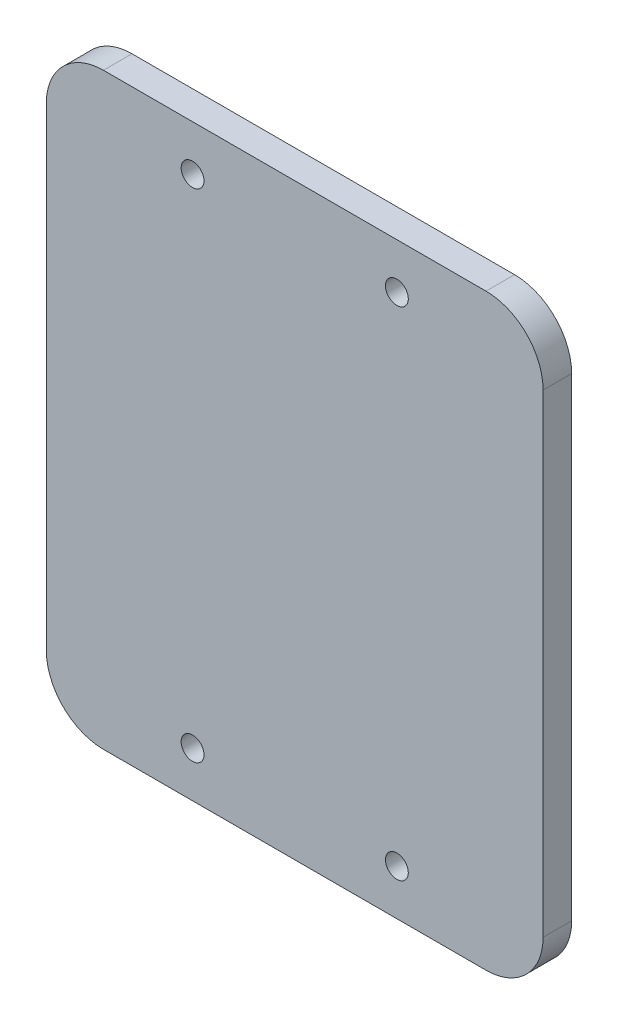
ISO-10303-21;
HEADER;
FILE_DESCRIPTION(('STEP AP214'),'2;1');
FILE_NAME('part.step','',(''),(''),'','','');
FILE_SCHEMA(('AUTOMOTIVE_DESIGN { 1 0 10303 214 1 1 1 1 }'));
ENDSEC;
DATA;
#1=APPLICATION_CONTEXT('core data for automotive mechanical design processes');
#2=APPLICATION_PROTOCOL_DEFINITION('international standard','automotive_design',2000,#1);
#3=PRODUCT_CONTEXT('',#1,'mechanical');
#4=PRODUCT('Part','Part','',(#3));
#5=PRODUCT_RELATED_PRODUCT_CATEGORY('part','',(#4));
#6=PRODUCT_DEFINITION_FORMATION('','',#4);
#7=PRODUCT_DEFINITION_CONTEXT('part definition',#1,'design');
#8=PRODUCT_DEFINITION('design','',#6,#7);
#9=PRODUCT_DEFINITION_SHAPE('','',#8);
#10=(LENGTH_UNIT() NAMED_UNIT(*) SI_UNIT(.MILLI.,.METRE.));
#11=(NAMED_UNIT(*) PLANE_ANGLE_UNIT() SI_UNIT($,.RADIAN.));
#12=(NAMED_UNIT(*) SI_UNIT($,.STERADIAN.) SOLID_ANGLE_UNIT());
#13=UNCERTAINTY_MEASURE_WITH_UNIT(LENGTH_MEASURE(1.E-05),#10,'distance_accuracy_value','');
#14=(GEOMETRIC_REPRESENTATION_CONTEXT(3) GLOBAL_UNCERTAINTY_ASSIGNED_CONTEXT((#13)) GLOBAL_UNIT_ASSIGNED_CONTEXT((#10,
#11,#12)) REPRESENTATION_CONTEXT('',''));
#15=CARTESIAN_POINT('',(0.,0.,0.));
#16=DIRECTION('',(0.,0.,1.));
#17=DIRECTION('',(1.,0.,0.));
#18=AXIS2_PLACEMENT_3D('',#15,#16,#17);
#19=CARTESIAN_POINT('',(-30.1091615376854,-82.8172384219554,5.));
#20=DIRECTION('',(0.,0.,1.));
#21=DIRECTION('',(1.,0.,0.));
#22=AXIS2_PLACEMENT_3D('',#19,#20,#21);
#23=PLANE('',#22);
#24=CARTESIAN_POINT('',(31.2808384623146,-74.8372384219554,5.));
#25=DIRECTION('',(0.,0.,1.));
#26=DIRECTION('',(1.,0.,0.));
#27=AXIS2_PLACEMENT_3D('',#24,#25,#26);
#28=CIRCLE('',#27,2.);
#29=CARTESIAN_POINT('',(33.2808384623146,-74.8372384219554,5.));
#30=VERTEX_POINT('',#29);
#31=EDGE_CURVE('E185',#30,#30,#28,.T.);
#32=ORIENTED_EDGE('',*,*,#31,.F.);
#33=EDGE_LOOP('',(#32));
#34=FACE_BOUND('',#33,.T.);
#35=CARTESIAN_POINT('',(-4.49916153768539,12.2027615780446,5.));
#36=DIRECTION('',(0.,0.,1.));
#37=DIRECTION('',(1.,0.,0.));
#38=AXIS2_PLACEMENT_3D('',#35,#36,#37);
#39=CIRCLE('',#38,2.);
#40=CARTESIAN_POINT('',(-2.49916153768539,12.2027615780446,5.));
#41=VERTEX_POINT('',#40);
#42=EDGE_CURVE('E131',#41,#41,#39,.T.);
#43=ORIENTED_EDGE('',*,*,#42,.F.);
#44=EDGE_LOOP('',(#43));
#45=FACE_BOUND('',#44,.T.);
#46=DIRECTION('',(0.,-1.,0.));
#47=VECTOR('',#46,1.);
#48=CARTESIAN_POINT('',(-30.1091615376854,20.1827615780446,5.));
#49=LINE('',#48,#47);
#50=CARTESIAN_POINT('',(-30.1091615376854,10.1827615780446,5.));
#51=VERTEX_POINT('',#50);
#52=CARTESIAN_POINT('',(-30.1091615376854,-72.8172384219554,5.));
#53=VERTEX_POINT('',#52);
#54=EDGE_CURVE('E136',#51,#53,#49,.T.);
#55=ORIENTED_EDGE('',*,*,#54,.T.);
#56=CARTESIAN_POINT('',(-20.1091615376854,-72.8172384219554,5.));
#57=DIRECTION('',(0.,0.,1.));
#58=DIRECTION('',(1.,0.,0.));
#59=AXIS2_PLACEMENT_3D('',#56,#57,#58);
#60=CIRCLE('',#59,10.);
#61=CARTESIAN_POINT('',(-20.1091615376854,-82.8172384219554,5.));
#62=VERTEX_POINT('',#61);
#63=EDGE_CURVE('E151',#53,#62,#60,.T.);
#64=ORIENTED_EDGE('',*,*,#63,.T.);
#65=DIRECTION('',(1.,0.,0.));
#66=VECTOR('',#65,1.);
#67=CARTESIAN_POINT('',(-30.1091615376854,-82.8172384219554,5.));
#68=LINE('',#67,#66);
#69=CARTESIAN_POINT('',(46.8908384623146,-82.8172384219554,5.));
#70=VERTEX_POINT('',#69);
#71=EDGE_CURVE('E118',#62,#70,#68,.T.);
#72=ORIENTED_EDGE('',*,*,#71,.T.);
#73=CARTESIAN_POINT('',(46.8908384623146,-72.8172384219554,5.));
#74=DIRECTION('',(0.,0.,1.));
#75=DIRECTION('',(1.,0.,0.));
#76=AXIS2_PLACEMENT_3D('',#73,#74,#75);
#77=CIRCLE('',#76,10.);
#78=CARTESIAN_POINT('',(56.8908384623146,-72.8172384219554,5.));
#79=VERTEX_POINT('',#78);
#80=EDGE_CURVE('E149',#70,#79,#77,.T.);
#81=ORIENTED_EDGE('',*,*,#80,.T.);
#82=DIRECTION('',(0.,1.,0.));
#83=VECTOR('',#82,1.);
#84=CARTESIAN_POINT('',(56.8908384623146,20.1827615780446,5.));
#85=LINE('',#84,#83);
#86=CARTESIAN_POINT('',(56.8908384623146,10.1827615780446,5.));
#87=VERTEX_POINT('',#86);
#88=EDGE_CURVE('E162',#79,#87,#85,.T.);
#89=ORIENTED_EDGE('',*,*,#88,.T.);
#90=CARTESIAN_POINT('',(46.8908384623146,10.1827615780446,5.));
#91=DIRECTION('',(0.,0.,1.));
#92=DIRECTION('',(1.,0.,0.));
#93=AXIS2_PLACEMENT_3D('',#90,#91,#92);
#94=CIRCLE('',#93,10.);
#95=CARTESIAN_POINT('',(46.8908384623146,20.1827615780446,5.));
#96=VERTEX_POINT('',#95);
#97=EDGE_CURVE('E53',#87,#96,#94,.T.);
#98=ORIENTED_EDGE('',*,*,#97,.T.);
#99=DIRECTION('',(-1.,0.,0.));
#100=VECTOR('',#99,1.);
#101=CARTESIAN_POINT('',(-30.1091615376854,20.1827615780446,5.));
#102=LINE('',#101,#100);
#103=CARTESIAN_POINT('',(-20.1091615376854,20.1827615780446,5.));
#104=VERTEX_POINT('',#103);
#105=EDGE_CURVE('E137',#96,#104,#102,.T.);
#106=ORIENTED_EDGE('',*,*,#105,.T.);
#107=CARTESIAN_POINT('',(-20.1091615376854,10.1827615780446,5.));
#108=DIRECTION('',(0.,0.,1.));
#109=DIRECTION('',(1.,0.,0.));
#110=AXIS2_PLACEMENT_3D('',#107,#108,#109);
#111=CIRCLE('',#110,10.);
#112=EDGE_CURVE('E146',#104,#51,#111,.T.);
#113=ORIENTED_EDGE('',*,*,#112,.T.);
#114=EDGE_LOOP('',(#55,#64,#72,#81,#89,#98,#106,#113));
#115=FACE_BOUND('',#114,.T.);
#116=CARTESIAN_POINT('',(31.2808384623146,12.2027615780446,5.));
#117=DIRECTION('',(0.,0.,1.));
#118=DIRECTION('',(-1.,0.,0.));
#119=AXIS2_PLACEMENT_3D('',#116,#117,#118);
#120=CIRCLE('',#119,2.);
#121=CARTESIAN_POINT('',(29.2808384623146,12.2027615780446,5.));
#122=VERTEX_POINT('',#121);
#123=EDGE_CURVE('E179',#122,#122,#120,.T.);
#124=ORIENTED_EDGE('',*,*,#123,.F.);
#125=EDGE_LOOP('',(#124));
#126=FACE_BOUND('',#125,.T.);
#127=CARTESIAN_POINT('',(-4.49916153768539,-74.8372384219554,5.));
#128=DIRECTION('',(0.,0.,1.));
#129=DIRECTION('',(-1.,0.,0.));
#130=AXIS2_PLACEMENT_3D('',#127,#128,#129);
#131=CIRCLE('',#130,2.);
#132=CARTESIAN_POINT('',(-6.4991615376854,-74.8372384219554,5.));
#133=VERTEX_POINT('',#132);
#134=EDGE_CURVE('E191',#133,#133,#131,.T.);
#135=ORIENTED_EDGE('',*,*,#134,.F.);
#136=EDGE_LOOP('',(#135));
#137=FACE_BOUND('',#136,.T.);
#138=ADVANCED_FACE('F32',(#34,#45,#115,#126,#137),#23,.T.);
#139=CARTESIAN_POINT('',(-30.1091615376854,-82.8172384219554,0.));
#140=DIRECTION('',(0.,0.,1.));
#141=DIRECTION('',(1.,0.,0.));
#142=AXIS2_PLACEMENT_3D('',#139,#140,#141);
#143=PLANE('',#142);
#144=CARTESIAN_POINT('',(31.2808384623146,-74.8372384219554,0.));
#145=DIRECTION('',(0.,0.,1.));
#146=DIRECTION('',(1.,0.,0.));
#147=AXIS2_PLACEMENT_3D('',#144,#145,#146);
#148=CIRCLE('',#147,2.);
#149=CARTESIAN_POINT('',(33.2808384623146,-74.8372384219554,0.));
#150=VERTEX_POINT('',#149);
#151=EDGE_CURVE('E188',#150,#150,#148,.T.);
#152=ORIENTED_EDGE('',*,*,#151,.T.);
#153=EDGE_LOOP('',(#152));
#154=FACE_BOUND('',#153,.T.);
#155=CARTESIAN_POINT('',(-4.49916153768539,12.2027615780446,0.));
#156=DIRECTION('',(0.,0.,1.));
#157=DIRECTION('',(1.,0.,0.));
#158=AXIS2_PLACEMENT_3D('',#155,#156,#157);
#159=CIRCLE('',#158,2.);
#160=CARTESIAN_POINT('',(-2.49916153768539,12.2027615780446,0.));
#161=VERTEX_POINT('',#160);
#162=EDGE_CURVE('E176',#161,#161,#159,.T.);
#163=ORIENTED_EDGE('',*,*,#162,.T.);
#164=EDGE_LOOP('',(#163));
#165=FACE_BOUND('',#164,.T.);
#166=DIRECTION('',(1.,0.,0.));
#167=VECTOR('',#166,1.);
#168=CARTESIAN_POINT('',(-30.1091615376854,-82.8172384219554,0.));
#169=LINE('',#168,#167);
#170=CARTESIAN_POINT('',(-20.1091615376854,-82.8172384219554,0.));
#171=VERTEX_POINT('',#170);
#172=CARTESIAN_POINT('',(46.8908384623146,-82.8172384219554,0.));
#173=VERTEX_POINT('',#172);
#174=EDGE_CURVE('E115',#171,#173,#169,.T.);
#175=ORIENTED_EDGE('',*,*,#174,.F.);
#176=CARTESIAN_POINT('',(-20.1091615376854,-72.8172384219554,0.));
#177=DIRECTION('',(0.,0.,1.));
#178=DIRECTION('',(1.,0.,0.));
#179=AXIS2_PLACEMENT_3D('',#176,#177,#178);
#180=CIRCLE('',#179,10.);
#181=CARTESIAN_POINT('',(-30.1091615376854,-72.8172384219554,0.));
#182=VERTEX_POINT('',#181);
#183=EDGE_CURVE('E98',#171,#182,#180,.F.);
#184=ORIENTED_EDGE('',*,*,#183,.T.);
#185=DIRECTION('',(0.,-1.,0.));
#186=VECTOR('',#185,1.);
#187=CARTESIAN_POINT('',(-30.1091615376854,20.1827615780446,0.));
#188=LINE('',#187,#186);
#189=CARTESIAN_POINT('',(-30.1091615376854,10.1827615780446,0.));
#190=VERTEX_POINT('',#189);
#191=EDGE_CURVE('E126',#190,#182,#188,.T.);
#192=ORIENTED_EDGE('',*,*,#191,.F.);
#193=CARTESIAN_POINT('',(-20.1091615376854,10.1827615780446,0.));
#194=DIRECTION('',(0.,0.,1.));
#195=DIRECTION('',(1.,0.,0.));
#196=AXIS2_PLACEMENT_3D('',#193,#194,#195);
#197=CIRCLE('',#196,10.);
#198=CARTESIAN_POINT('',(-20.1091615376854,20.1827615780446,0.));
#199=VERTEX_POINT('',#198);
#200=EDGE_CURVE('E119',#190,#199,#197,.F.);
#201=ORIENTED_EDGE('',*,*,#200,.T.);
#202=DIRECTION('',(-1.,0.,0.));
#203=VECTOR('',#202,1.);
#204=CARTESIAN_POINT('',(-30.1091615376854,20.1827615780446,0.));
#205=LINE('',#204,#203);
#206=CARTESIAN_POINT('',(46.8908384623146,20.1827615780446,0.));
#207=VERTEX_POINT('',#206);
#208=EDGE_CURVE('E129',#207,#199,#205,.T.);
#209=ORIENTED_EDGE('',*,*,#208,.F.);
#210=CARTESIAN_POINT('',(46.8908384623146,10.1827615780446,0.));
#211=DIRECTION('',(0.,0.,1.));
#212=DIRECTION('',(1.,0.,0.));
#213=AXIS2_PLACEMENT_3D('',#210,#211,#212);
#214=CIRCLE('',#213,10.);
#215=CARTESIAN_POINT('',(56.8908384623146,10.1827615780446,0.));
#216=VERTEX_POINT('',#215);
#217=EDGE_CURVE('E140',#207,#216,#214,.F.);
#218=ORIENTED_EDGE('',*,*,#217,.T.);
#219=DIRECTION('',(0.,1.,0.));
#220=VECTOR('',#219,1.);
#221=CARTESIAN_POINT('',(56.8908384623146,20.1827615780446,0.));
#222=LINE('',#221,#220);
#223=CARTESIAN_POINT('',(56.8908384623146,-72.8172384219554,0.));
#224=VERTEX_POINT('',#223);
#225=EDGE_CURVE('E125',#224,#216,#222,.T.);
#226=ORIENTED_EDGE('',*,*,#225,.F.);
#227=CARTESIAN_POINT('',(46.8908384623146,-72.8172384219554,0.));
#228=DIRECTION('',(0.,0.,1.));
#229=DIRECTION('',(1.,0.,0.));
#230=AXIS2_PLACEMENT_3D('',#227,#228,#229);
#231=CIRCLE('',#230,10.);
#232=EDGE_CURVE('E109',#224,#173,#231,.F.);
#233=ORIENTED_EDGE('',*,*,#232,.T.);
#234=EDGE_LOOP('',(#175,#184,#192,#201,#209,#218,#226,#233));
#235=FACE_BOUND('',#234,.T.);
#236=CARTESIAN_POINT('',(31.2808384623146,12.2027615780446,0.));
#237=DIRECTION('',(0.,0.,1.));
#238=DIRECTION('',(-1.,0.,0.));
#239=AXIS2_PLACEMENT_3D('',#236,#237,#238);
#240=CIRCLE('',#239,2.);
#241=CARTESIAN_POINT('',(29.2808384623146,12.2027615780446,0.));
#242=VERTEX_POINT('',#241);
#243=EDGE_CURVE('E182',#242,#242,#240,.T.);
#244=ORIENTED_EDGE('',*,*,#243,.T.);
#245=EDGE_LOOP('',(#244));
#246=FACE_BOUND('',#245,.T.);
#247=CARTESIAN_POINT('',(-4.49916153768539,-74.8372384219554,0.));
#248=DIRECTION('',(0.,0.,1.));
#249=DIRECTION('',(-1.,0.,0.));
#250=AXIS2_PLACEMENT_3D('',#247,#248,#249);
#251=CIRCLE('',#250,2.);
#252=CARTESIAN_POINT('',(-6.4991615376854,-74.8372384219554,0.));
#253=VERTEX_POINT('',#252);
#254=EDGE_CURVE('E194',#253,#253,#251,.T.);
#255=ORIENTED_EDGE('',*,*,#254,.T.);
#256=EDGE_LOOP('',(#255));
#257=FACE_BOUND('',#256,.T.);
#258=ADVANCED_FACE('F122',(#154,#165,#235,#246,#257),#143,.F.);
#259=CARTESIAN_POINT('',(-30.1091615376854,20.1827615780446,5.));
#260=DIRECTION('',(1.,0.,0.));
#261=DIRECTION('',(0.,1.,0.));
#262=AXIS2_PLACEMENT_3D('',#259,#260,#261);
#263=PLANE('',#262);
#264=ORIENTED_EDGE('',*,*,#191,.T.);
#265=DIRECTION('',(0.,0.,-1.));
#266=VECTOR('',#265,1.);
#267=CARTESIAN_POINT('',(-30.1091615376854,-72.8172384219554,5.));
#268=LINE('',#267,#266);
#269=EDGE_CURVE('E103',#182,#53,#268,.F.);
#270=ORIENTED_EDGE('',*,*,#269,.T.);
#271=ORIENTED_EDGE('',*,*,#54,.F.);
#272=DIRECTION('',(0.,0.,-1.));
#273=VECTOR('',#272,1.);
#274=CARTESIAN_POINT('',(-30.1091615376854,10.1827615780446,5.));
#275=LINE('',#274,#273);
#276=EDGE_CURVE('E108',#51,#190,#275,.T.);
#277=ORIENTED_EDGE('',*,*,#276,.T.);
#278=EDGE_LOOP('',(#264,#270,#271,#277));
#279=FACE_BOUND('',#278,.T.);
#280=ADVANCED_FACE('F209',(#279),#263,.F.);
#281=CARTESIAN_POINT('',(-30.1091615376854,-82.8172384219554,5.));
#282=DIRECTION('',(0.,1.,0.));
#283=DIRECTION('',(0.,0.,1.));
#284=AXIS2_PLACEMENT_3D('',#281,#282,#283);
#285=PLANE('',#284);
#286=ORIENTED_EDGE('',*,*,#71,.F.);
#287=DIRECTION('',(0.,0.,-1.));
#288=VECTOR('',#287,1.);
#289=CARTESIAN_POINT('',(-20.1091615376854,-82.8172384219554,5.));
#290=LINE('',#289,#288);
#291=EDGE_CURVE('E102',#62,#171,#290,.T.);
#292=ORIENTED_EDGE('',*,*,#291,.T.);
#293=ORIENTED_EDGE('',*,*,#174,.T.);
#294=DIRECTION('',(0.,0.,-1.));
#295=VECTOR('',#294,1.);
#296=CARTESIAN_POINT('',(46.8908384623146,-82.8172384219554,5.));
#297=LINE('',#296,#295);
#298=EDGE_CURVE('E120',#173,#70,#297,.F.);
#299=ORIENTED_EDGE('',*,*,#298,.T.);
#300=EDGE_LOOP('',(#286,#292,#293,#299));
#301=FACE_BOUND('',#300,.T.);
#302=ADVANCED_FACE('F114',(#301),#285,.F.);
#303=CARTESIAN_POINT('',(56.8908384623146,20.1827615780446,5.));
#304=DIRECTION('',(-1.,0.,0.));
#305=DIRECTION('',(0.,-1.,0.));
#306=AXIS2_PLACEMENT_3D('',#303,#304,#305);
#307=PLANE('',#306);
#308=ORIENTED_EDGE('',*,*,#88,.F.);
#309=DIRECTION('',(0.,0.,-1.));
#310=VECTOR('',#309,1.);
#311=CARTESIAN_POINT('',(56.8908384623146,-72.8172384219554,5.));
#312=LINE('',#311,#310);
#313=EDGE_CURVE('E155',#79,#224,#312,.T.);
#314=ORIENTED_EDGE('',*,*,#313,.T.);
#315=ORIENTED_EDGE('',*,*,#225,.T.);
#316=DIRECTION('',(0.,0.,-1.));
#317=VECTOR('',#316,1.);
#318=CARTESIAN_POINT('',(56.8908384623146,10.1827615780446,5.));
#319=LINE('',#318,#317);
#320=EDGE_CURVE('E153',#216,#87,#319,.F.);
#321=ORIENTED_EDGE('',*,*,#320,.T.);
#322=EDGE_LOOP('',(#308,#314,#315,#321));
#323=FACE_BOUND('',#322,.T.);
#324=ADVANCED_FACE('F160',(#323),#307,.F.);
#325=CARTESIAN_POINT('',(-30.1091615376854,20.1827615780446,5.));
#326=DIRECTION('',(0.,-1.,0.));
#327=DIRECTION('',(0.,0.,-1.));
#328=AXIS2_PLACEMENT_3D('',#325,#326,#327);
#329=PLANE('',#328);
#330=ORIENTED_EDGE('',*,*,#105,.F.);
#331=DIRECTION('',(0.,0.,-1.));
#332=VECTOR('',#331,1.);
#333=CARTESIAN_POINT('',(46.8908384623146,20.1827615780446,5.));
#334=LINE('',#333,#332);
#335=EDGE_CURVE('E11',#96,#207,#334,.T.);
#336=ORIENTED_EDGE('',*,*,#335,.T.);
#337=ORIENTED_EDGE('',*,*,#208,.T.);
#338=DIRECTION('',(0.,0.,-1.));
#339=VECTOR('',#338,1.);
#340=CARTESIAN_POINT('',(-20.1091615376854,20.1827615780446,5.));
#341=LINE('',#340,#339);
#342=EDGE_CURVE('E40',#199,#104,#341,.F.);
#343=ORIENTED_EDGE('',*,*,#342,.T.);
#344=EDGE_LOOP('',(#330,#336,#337,#343));
#345=FACE_BOUND('',#344,.T.);
#346=ADVANCED_FACE('F169',(#345),#329,.F.);
#347=CARTESIAN_POINT('',(-4.49916153768539,12.2027615780446,5.));
#348=DIRECTION('',(0.,0.,-1.));
#349=DIRECTION('',(-1.,0.,0.));
#350=AXIS2_PLACEMENT_3D('',#347,#348,#349);
#351=CYLINDRICAL_SURFACE('',#350,2.);
#352=ORIENTED_EDGE('',*,*,#42,.T.);
#353=EDGE_LOOP('',(#352));
#354=FACE_BOUND('',#353,.T.);
#355=ORIENTED_EDGE('',*,*,#162,.F.);
#356=EDGE_LOOP('',(#355));
#357=FACE_BOUND('',#356,.T.);
#358=ADVANCED_FACE('F215',(#354,#357),#351,.F.);
#359=CARTESIAN_POINT('',(31.2808384623146,12.2027615780446,5.));
#360=DIRECTION('',(0.,0.,-1.));
#361=DIRECTION('',(-1.,0.,0.));
#362=AXIS2_PLACEMENT_3D('',#359,#360,#361);
#363=CYLINDRICAL_SURFACE('',#362,2.);
#364=ORIENTED_EDGE('',*,*,#123,.T.);
#365=EDGE_LOOP('',(#364));
#366=FACE_BOUND('',#365,.T.);
#367=ORIENTED_EDGE('',*,*,#243,.F.);
#368=EDGE_LOOP('',(#367));
#369=FACE_BOUND('',#368,.T.);
#370=ADVANCED_FACE('F243',(#366,#369),#363,.F.);
#371=CARTESIAN_POINT('',(31.2808384623146,-74.8372384219554,5.));
#372=DIRECTION('',(0.,0.,-1.));
#373=DIRECTION('',(-1.,0.,0.));
#374=AXIS2_PLACEMENT_3D('',#371,#372,#373);
#375=CYLINDRICAL_SURFACE('',#374,2.);
#376=ORIENTED_EDGE('',*,*,#31,.T.);
#377=EDGE_LOOP('',(#376));
#378=FACE_BOUND('',#377,.T.);
#379=ORIENTED_EDGE('',*,*,#151,.F.);
#380=EDGE_LOOP('',(#379));
#381=FACE_BOUND('',#380,.T.);
#382=ADVANCED_FACE('F246',(#378,#381),#375,.F.);
#383=CARTESIAN_POINT('',(-4.49916153768539,-74.8372384219554,5.));
#384=DIRECTION('',(0.,0.,-1.));
#385=DIRECTION('',(-1.,0.,0.));
#386=AXIS2_PLACEMENT_3D('',#383,#384,#385);
#387=CYLINDRICAL_SURFACE('',#386,2.);
#388=ORIENTED_EDGE('',*,*,#134,.T.);
#389=EDGE_LOOP('',(#388));
#390=FACE_BOUND('',#389,.T.);
#391=ORIENTED_EDGE('',*,*,#254,.F.);
#392=EDGE_LOOP('',(#391));
#393=FACE_BOUND('',#392,.T.);
#394=ADVANCED_FACE('F200',(#390,#393),#387,.F.);
#395=CARTESIAN_POINT('',(-20.1091615376854,-72.8172384219554,5.));
#396=DIRECTION('',(0.,0.,-1.));
#397=DIRECTION('',(-1.,0.,0.));
#398=AXIS2_PLACEMENT_3D('',#395,#396,#397);
#399=CYLINDRICAL_SURFACE('',#398,10.);
#400=ORIENTED_EDGE('',*,*,#63,.F.);
#401=ORIENTED_EDGE('',*,*,#269,.F.);
#402=ORIENTED_EDGE('',*,*,#183,.F.);
#403=ORIENTED_EDGE('',*,*,#291,.F.);
#404=EDGE_LOOP('',(#400,#401,#402,#403));
#405=FACE_BOUND('',#404,.T.);
#406=ADVANCED_FACE('F101',(#405),#399,.T.);
#407=CARTESIAN_POINT('',(46.8908384623146,-72.8172384219554,5.));
#408=DIRECTION('',(0.,0.,-1.));
#409=DIRECTION('',(-1.,0.,0.));
#410=AXIS2_PLACEMENT_3D('',#407,#408,#409);
#411=CYLINDRICAL_SURFACE('',#410,10.);
#412=ORIENTED_EDGE('',*,*,#80,.F.);
#413=ORIENTED_EDGE('',*,*,#298,.F.);
#414=ORIENTED_EDGE('',*,*,#232,.F.);
#415=ORIENTED_EDGE('',*,*,#313,.F.);
#416=EDGE_LOOP('',(#412,#413,#414,#415));
#417=FACE_BOUND('',#416,.T.);
#418=ADVANCED_FACE('F229',(#417),#411,.T.);
#419=CARTESIAN_POINT('',(46.8908384623146,10.1827615780446,5.));
#420=DIRECTION('',(0.,0.,-1.));
#421=DIRECTION('',(-1.,0.,0.));
#422=AXIS2_PLACEMENT_3D('',#419,#420,#421);
#423=CYLINDRICAL_SURFACE('',#422,10.);
#424=ORIENTED_EDGE('',*,*,#97,.F.);
#425=ORIENTED_EDGE('',*,*,#320,.F.);
#426=ORIENTED_EDGE('',*,*,#217,.F.);
#427=ORIENTED_EDGE('',*,*,#335,.F.);
#428=EDGE_LOOP('',(#424,#425,#426,#427));
#429=FACE_BOUND('',#428,.T.);
#430=ADVANCED_FACE('F168',(#429),#423,.T.);
#431=CARTESIAN_POINT('',(-20.1091615376854,10.1827615780446,5.));
#432=DIRECTION('',(0.,0.,-1.));
#433=DIRECTION('',(-1.,0.,0.));
#434=AXIS2_PLACEMENT_3D('',#431,#432,#433);
#435=CYLINDRICAL_SURFACE('',#434,10.);
#436=ORIENTED_EDGE('',*,*,#112,.F.);
#437=ORIENTED_EDGE('',*,*,#342,.F.);
#438=ORIENTED_EDGE('',*,*,#200,.F.);
#439=ORIENTED_EDGE('',*,*,#276,.F.);
#440=EDGE_LOOP('',(#436,#437,#438,#439));
#441=FACE_BOUND('',#440,.T.);
#442=ADVANCED_FACE('F34',(#441),#435,.T.);
#443=CLOSED_SHELL('',(#138,#258,#280,#302,#324,#346,#358,#370,#382,#394,#406,#418,#430,#442));
#444=MANIFOLD_SOLID_BREP('B2',#443);
#445=ADVANCED_BREP_SHAPE_REPRESENTATION('',(#18,#444),#14);
#446=SHAPE_DEFINITION_REPRESENTATION(#9,#445);
ENDSEC;
END-ISO-10303-21;
